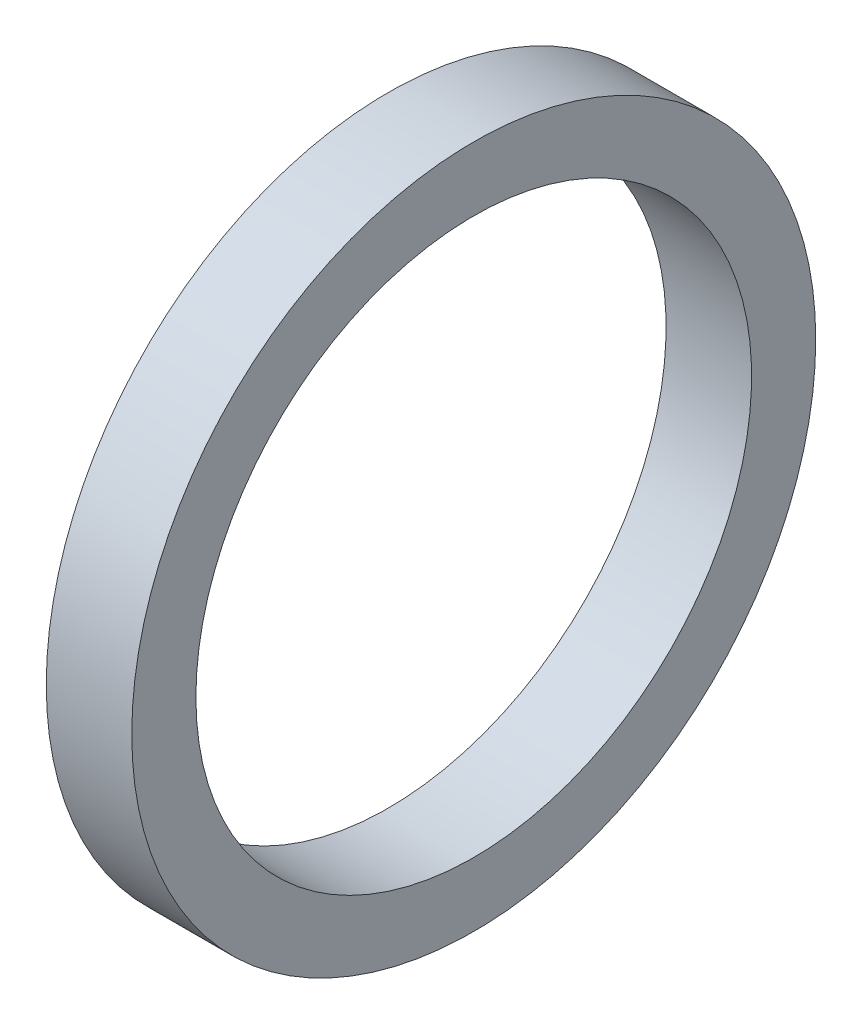
ISO-10303-21;
HEADER;
FILE_DESCRIPTION(('STEP AP214'),'2;1');
FILE_NAME('part.step','',(''),(''),'','','');
FILE_SCHEMA(('AUTOMOTIVE_DESIGN { 1 0 10303 214 1 1 1 1 }'));
ENDSEC;
DATA;
#1=APPLICATION_CONTEXT('core data for automotive mechanical design processes');
#2=APPLICATION_PROTOCOL_DEFINITION('international standard','automotive_design',2000,#1);
#3=PRODUCT_CONTEXT('',#1,'mechanical');
#4=PRODUCT('Part','Part','',(#3));
#5=PRODUCT_RELATED_PRODUCT_CATEGORY('part','',(#4));
#6=PRODUCT_DEFINITION_FORMATION('','',#4);
#7=PRODUCT_DEFINITION_CONTEXT('part definition',#1,'design');
#8=PRODUCT_DEFINITION('design','',#6,#7);
#9=PRODUCT_DEFINITION_SHAPE('','',#8);
#10=(LENGTH_UNIT() NAMED_UNIT(*) SI_UNIT(.MILLI.,.METRE.));
#11=(NAMED_UNIT(*) PLANE_ANGLE_UNIT() SI_UNIT($,.RADIAN.));
#12=(NAMED_UNIT(*) SI_UNIT($,.STERADIAN.) SOLID_ANGLE_UNIT());
#13=UNCERTAINTY_MEASURE_WITH_UNIT(LENGTH_MEASURE(1.E-05),#10,'distance_accuracy_value','');
#14=(GEOMETRIC_REPRESENTATION_CONTEXT(3) GLOBAL_UNCERTAINTY_ASSIGNED_CONTEXT((#13)) GLOBAL_UNIT_ASSIGNED_CONTEXT((#10,
#11,#12)) REPRESENTATION_CONTEXT('',''));
#15=CARTESIAN_POINT('',(0.,0.,0.));
#16=DIRECTION('',(0.,0.,1.));
#17=DIRECTION('',(1.,0.,0.));
#18=AXIS2_PLACEMENT_3D('',#15,#16,#17);
#19=CARTESIAN_POINT('',(0.,40.,0.));
#20=DIRECTION('',(1.,0.,0.));
#21=DIRECTION('',(0.,0.,-1.));
#22=AXIS2_PLACEMENT_3D('',#19,#20,#21);
#23=PLANE('',#22);
#24=CARTESIAN_POINT('',(0.,0.,0.));
#25=DIRECTION('',(-1.,0.,0.));
#26=DIRECTION('',(0.,0.,1.));
#27=AXIS2_PLACEMENT_3D('',#24,#25,#26);
#28=CIRCLE('',#27,32.5);
#29=CARTESIAN_POINT('',(0.,0.,32.5));
#30=VERTEX_POINT('',#29);
#31=EDGE_CURVE('E10',#30,#30,#28,.T.);
#32=ORIENTED_EDGE('',*,*,#31,.F.);
#33=EDGE_LOOP('',(#32));
#34=FACE_BOUND('',#33,.T.);
#35=CARTESIAN_POINT('',(0.,0.,0.));
#36=DIRECTION('',(-1.,0.,0.));
#37=DIRECTION('',(0.,0.,1.));
#38=AXIS2_PLACEMENT_3D('',#35,#36,#37);
#39=CIRCLE('',#38,40.);
#40=CARTESIAN_POINT('',(0.,0.,40.));
#41=VERTEX_POINT('',#40);
#42=EDGE_CURVE('E54',#41,#41,#39,.T.);
#43=ORIENTED_EDGE('',*,*,#42,.T.);
#44=EDGE_LOOP('',(#43));
#45=FACE_BOUND('',#44,.T.);
#46=ADVANCED_FACE('F41',(#34,#45),#23,.F.);
#47=CARTESIAN_POINT('',(-59.6592581066923,0.,0.));
#48=DIRECTION('',(-1.,0.,0.));
#49=DIRECTION('',(0.,0.,1.));
#50=AXIS2_PLACEMENT_3D('',#47,#48,#49);
#51=CYLINDRICAL_SURFACE('',#50,32.5);
#52=CARTESIAN_POINT('',(10.,0.,0.));
#53=DIRECTION('',(-1.,0.,0.));
#54=DIRECTION('',(0.,0.,1.));
#55=AXIS2_PLACEMENT_3D('',#52,#53,#54);
#56=CIRCLE('',#55,32.5);
#57=CARTESIAN_POINT('',(10.,0.,32.5));
#58=VERTEX_POINT('',#57);
#59=EDGE_CURVE('E50',#58,#58,#56,.T.);
#60=ORIENTED_EDGE('',*,*,#59,.F.);
#61=EDGE_LOOP('',(#60));
#62=FACE_BOUND('',#61,.T.);
#63=ORIENTED_EDGE('',*,*,#31,.T.);
#64=EDGE_LOOP('',(#63));
#65=FACE_BOUND('',#64,.T.);
#66=ADVANCED_FACE('F69',(#62,#65),#51,.F.);
#67=CARTESIAN_POINT('',(10.,32.5,0.));
#68=DIRECTION('',(-1.,0.,0.));
#69=DIRECTION('',(0.,0.,1.));
#70=AXIS2_PLACEMENT_3D('',#67,#68,#69);
#71=PLANE('',#70);
#72=CARTESIAN_POINT('',(10.,0.,0.));
#73=DIRECTION('',(-1.,0.,0.));
#74=DIRECTION('',(0.,0.,1.));
#75=AXIS2_PLACEMENT_3D('',#72,#73,#74);
#76=CIRCLE('',#75,40.);
#77=CARTESIAN_POINT('',(10.,0.,40.));
#78=VERTEX_POINT('',#77);
#79=EDGE_CURVE('E51',#78,#78,#76,.T.);
#80=ORIENTED_EDGE('',*,*,#79,.F.);
#81=EDGE_LOOP('',(#80));
#82=FACE_BOUND('',#81,.T.);
#83=ORIENTED_EDGE('',*,*,#59,.T.);
#84=EDGE_LOOP('',(#83));
#85=FACE_BOUND('',#84,.T.);
#86=ADVANCED_FACE('F61',(#82,#85),#71,.F.);
#87=CARTESIAN_POINT('',(-59.6592581066923,0.,0.));
#88=DIRECTION('',(-1.,0.,0.));
#89=DIRECTION('',(0.,0.,1.));
#90=AXIS2_PLACEMENT_3D('',#87,#88,#89);
#91=CYLINDRICAL_SURFACE('',#90,40.);
#92=ORIENTED_EDGE('',*,*,#42,.F.);
#93=EDGE_LOOP('',(#92));
#94=FACE_BOUND('',#93,.T.);
#95=ORIENTED_EDGE('',*,*,#79,.T.);
#96=EDGE_LOOP('',(#95));
#97=FACE_BOUND('',#96,.T.);
#98=ADVANCED_FACE('F64',(#94,#97),#91,.T.);
#99=CLOSED_SHELL('',(#46,#66,#86,#98));
#100=MANIFOLD_SOLID_BREP('B2',#99);
#101=ADVANCED_BREP_SHAPE_REPRESENTATION('',(#18,#100),#14);
#102=SHAPE_DEFINITION_REPRESENTATION(#9,#101);
ENDSEC;
END-ISO-10303-21;
